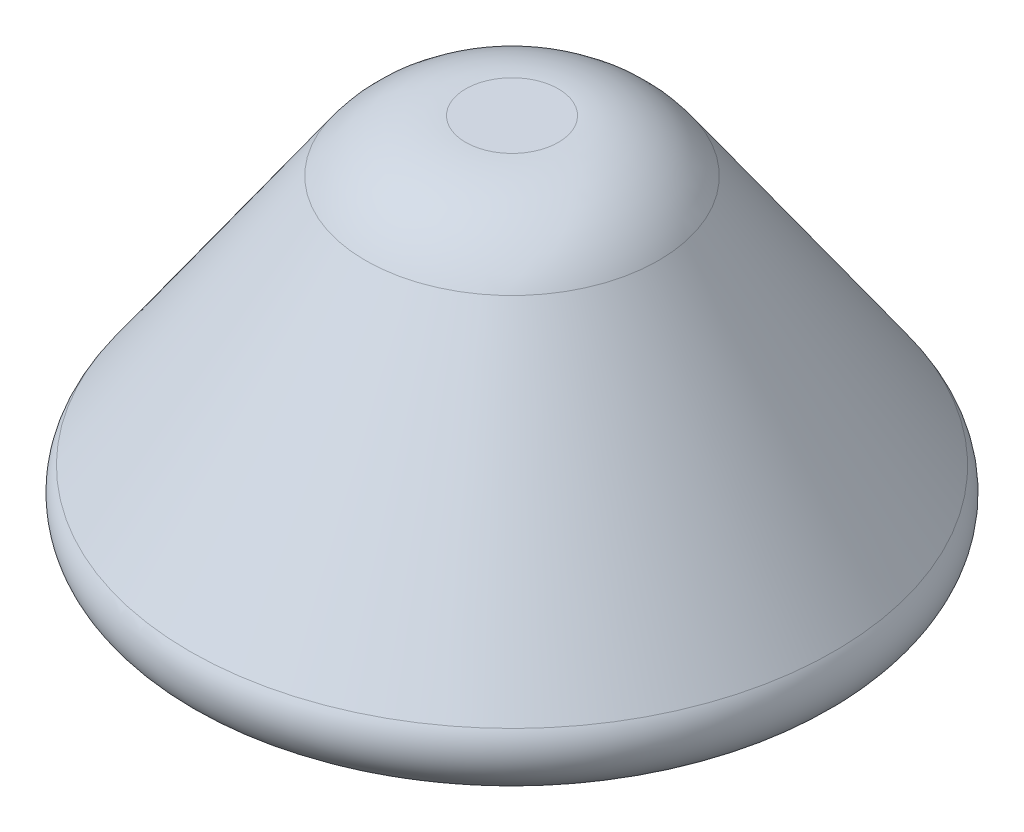
ISO-10303-21;
HEADER;
FILE_DESCRIPTION(('STEP AP214'),'2;1');
FILE_NAME('part.step','',(''),(''),'','','');
FILE_SCHEMA(('AUTOMOTIVE_DESIGN { 1 0 10303 214 1 1 1 1 }'));
ENDSEC;
DATA;
#1=APPLICATION_CONTEXT('core data for automotive mechanical design processes');
#2=APPLICATION_PROTOCOL_DEFINITION('international standard','automotive_design',2000,#1);
#3=PRODUCT_CONTEXT('',#1,'mechanical');
#4=PRODUCT('Part','Part','',(#3));
#5=PRODUCT_RELATED_PRODUCT_CATEGORY('part','',(#4));
#6=PRODUCT_DEFINITION_FORMATION('','',#4);
#7=PRODUCT_DEFINITION_CONTEXT('part definition',#1,'design');
#8=PRODUCT_DEFINITION('design','',#6,#7);
#9=PRODUCT_DEFINITION_SHAPE('','',#8);
#10=(LENGTH_UNIT() NAMED_UNIT(*) SI_UNIT(.MILLI.,.METRE.));
#11=(NAMED_UNIT(*) PLANE_ANGLE_UNIT() SI_UNIT($,.RADIAN.));
#12=(NAMED_UNIT(*) SI_UNIT($,.STERADIAN.) SOLID_ANGLE_UNIT());
#13=UNCERTAINTY_MEASURE_WITH_UNIT(LENGTH_MEASURE(1.E-05),#10,'distance_accuracy_value','');
#14=(GEOMETRIC_REPRESENTATION_CONTEXT(3) GLOBAL_UNCERTAINTY_ASSIGNED_CONTEXT((#13)) GLOBAL_UNIT_ASSIGNED_CONTEXT((#10,
#11,#12)) REPRESENTATION_CONTEXT('',''));
#15=CARTESIAN_POINT('',(0.,0.,0.));
#16=DIRECTION('',(0.,0.,1.));
#17=DIRECTION('',(1.,0.,0.));
#18=AXIS2_PLACEMENT_3D('',#15,#16,#17);
#19=CARTESIAN_POINT('',(0.,0.,0.));
#20=DIRECTION('',(0.,-1.,0.));
#21=DIRECTION('',(0.,0.,1.));
#22=AXIS2_PLACEMENT_3D('',#19,#20,#21);
#23=CONICAL_SURFACE('',#22,9.,0.610865238198017);
#24=CARTESIAN_POINT('',(0.,1.57357643635105,0.));
#25=DIRECTION('',(0.,1.,0.));
#26=DIRECTION('',(0.,0.,1.));
#27=AXIS2_PLACEMENT_3D('',#24,#25,#26);
#28=CIRCLE('',#27,7.89816991731782);
#29=CARTESIAN_POINT('',(0.,1.57357643635105,7.89816991731782));
#30=VERTEX_POINT('',#29);
#31=EDGE_CURVE('E40',#30,#30,#28,.T.);
#32=ORIENTED_EDGE('',*,*,#31,.T.);
#33=EDGE_LOOP('',(#32));
#34=FACE_BOUND('',#33,.T.);
#35=CARTESIAN_POINT('',(0.,7.72072930905314,0.));
#36=DIRECTION('',(0.,-1.,0.));
#37=DIRECTION('',(0.,0.,-1.));
#38=AXIS2_PLACEMENT_3D('',#35,#36,#37);
#39=CIRCLE('',#38,3.59388713732433);
#40=CARTESIAN_POINT('',(0.,7.72072930905314,-3.59388713732433));
#41=VERTEX_POINT('',#40);
#42=EDGE_CURVE('E44',#41,#41,#39,.T.);
#43=ORIENTED_EDGE('',*,*,#42,.T.);
#44=EDGE_LOOP('',(#43));
#45=FACE_BOUND('',#44,.T.);
#46=ADVANCED_FACE('F33',(#34,#45),#23,.T.);
#47=CARTESIAN_POINT('',(0.,9.,0.));
#48=DIRECTION('',(0.,1.,0.));
#49=DIRECTION('',(0.,0.,1.));
#50=AXIS2_PLACEMENT_3D('',#47,#48,#49);
#51=PLANE('',#50);
#52=CARTESIAN_POINT('',(0.,9.,0.));
#53=DIRECTION('',(0.,1.,0.));
#54=DIRECTION('',(0.,0.,1.));
#55=AXIS2_PLACEMENT_3D('',#52,#53,#54);
#56=CIRCLE('',#55,1.13643100445736);
#57=CARTESIAN_POINT('',(0.,9.,1.13643100445736));
#58=VERTEX_POINT('',#57);
#59=EDGE_CURVE('E48',#58,#58,#56,.T.);
#60=ORIENTED_EDGE('',*,*,#59,.T.);
#61=EDGE_LOOP('',(#60));
#62=FACE_BOUND('',#61,.T.);
#63=ADVANCED_FACE('F54',(#62),#51,.T.);
#64=CARTESIAN_POINT('',(0.,0.,0.));
#65=DIRECTION('',(0.,1.,0.));
#66=DIRECTION('',(0.,0.,1.));
#67=AXIS2_PLACEMENT_3D('',#64,#65,#66);
#68=PLANE('',#67);
#69=CARTESIAN_POINT('',(0.,0.,0.));
#70=DIRECTION('',(0.,1.,0.));
#71=DIRECTION('',(0.,0.,1.));
#72=AXIS2_PLACEMENT_3D('',#69,#70,#71);
#73=CIRCLE('',#72,7.07901787302883);
#74=CARTESIAN_POINT('',(0.,0.,7.07901787302883));
#75=VERTEX_POINT('',#74);
#76=EDGE_CURVE('E10',#75,#75,#73,.F.);
#77=ORIENTED_EDGE('',*,*,#76,.T.);
#78=EDGE_LOOP('',(#77));
#79=FACE_BOUND('',#78,.T.);
#80=ADVANCED_FACE('F58',(#79),#68,.F.);
#81=CARTESIAN_POINT('',(0.,6.,0.));
#82=DIRECTION('',(0.,1.,0.));
#83=DIRECTION('',(0.,0.,1.));
#84=AXIS2_PLACEMENT_3D('',#81,#82,#83);
#85=DEGENERATE_TOROIDAL_SURFACE('',#84,1.13643100445736,3.,.T.);
#86=ORIENTED_EDGE('',*,*,#42,.F.);
#87=EDGE_LOOP('',(#86));
#88=FACE_BOUND('',#87,.T.);
#89=ORIENTED_EDGE('',*,*,#59,.F.);
#90=EDGE_LOOP('',(#89));
#91=FACE_BOUND('',#90,.T.);
#92=ADVANCED_FACE('F56',(#88,#91),#85,.T.);
#93=CARTESIAN_POINT('',(0.,1.,0.));
#94=DIRECTION('',(0.,1.,0.));
#95=DIRECTION('',(0.,0.,1.));
#96=AXIS2_PLACEMENT_3D('',#93,#94,#95);
#97=TOROIDAL_SURFACE('',#96,7.07901787302883,1.);
#98=ORIENTED_EDGE('',*,*,#76,.F.);
#99=EDGE_LOOP('',(#98));
#100=FACE_BOUND('',#99,.T.);
#101=ORIENTED_EDGE('',*,*,#31,.F.);
#102=EDGE_LOOP('',(#101));
#103=FACE_BOUND('',#102,.T.);
#104=ADVANCED_FACE('F35',(#100,#103),#97,.T.);
#105=CLOSED_SHELL('',(#46,#63,#80,#92,#104));
#106=MANIFOLD_SOLID_BREP('B2',#105);
#107=ADVANCED_BREP_SHAPE_REPRESENTATION('',(#18,#106),#14);
#108=SHAPE_DEFINITION_REPRESENTATION(#9,#107);
ENDSEC;
END-ISO-10303-21;
